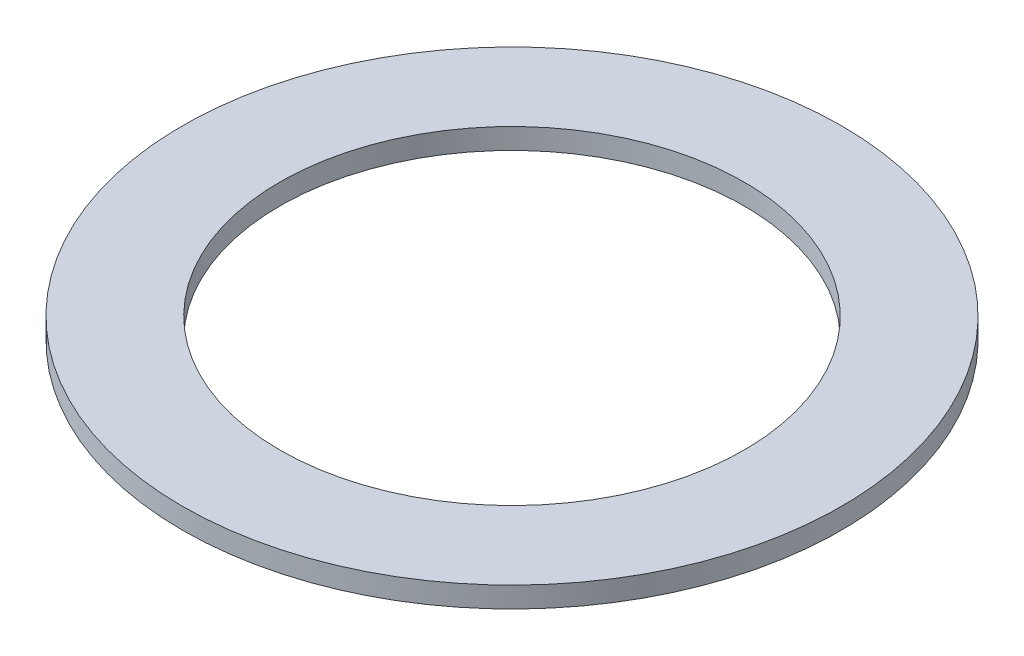
ISO-10303-21;
HEADER;
FILE_DESCRIPTION(('STEP AP214'),'2;1');
FILE_NAME('part.step','',(''),(''),'','','');
FILE_SCHEMA(('AUTOMOTIVE_DESIGN { 1 0 10303 214 1 1 1 1 }'));
ENDSEC;
DATA;
#1=APPLICATION_CONTEXT('core data for automotive mechanical design processes');
#2=APPLICATION_PROTOCOL_DEFINITION('international standard','automotive_design',2000,#1);
#3=PRODUCT_CONTEXT('',#1,'mechanical');
#4=PRODUCT('Part','Part','',(#3));
#5=PRODUCT_RELATED_PRODUCT_CATEGORY('part','',(#4));
#6=PRODUCT_DEFINITION_FORMATION('','',#4);
#7=PRODUCT_DEFINITION_CONTEXT('part definition',#1,'design');
#8=PRODUCT_DEFINITION('design','',#6,#7);
#9=PRODUCT_DEFINITION_SHAPE('','',#8);
#10=(LENGTH_UNIT() NAMED_UNIT(*) SI_UNIT(.MILLI.,.METRE.));
#11=(NAMED_UNIT(*) PLANE_ANGLE_UNIT() SI_UNIT($,.RADIAN.));
#12=(NAMED_UNIT(*) SI_UNIT($,.STERADIAN.) SOLID_ANGLE_UNIT());
#13=UNCERTAINTY_MEASURE_WITH_UNIT(LENGTH_MEASURE(1.E-05),#10,'distance_accuracy_value','');
#14=(GEOMETRIC_REPRESENTATION_CONTEXT(3) GLOBAL_UNCERTAINTY_ASSIGNED_CONTEXT((#13)) GLOBAL_UNIT_ASSIGNED_CONTEXT((#10,
#11,#12)) REPRESENTATION_CONTEXT('',''));
#15=CARTESIAN_POINT('',(0.,0.,0.));
#16=DIRECTION('',(0.,0.,1.));
#17=DIRECTION('',(1.,0.,0.));
#18=AXIS2_PLACEMENT_3D('',#15,#16,#17);
#19=CARTESIAN_POINT('',(0.,0.5,0.));
#20=DIRECTION('',(0.,1.,0.));
#21=DIRECTION('',(0.,0.,1.));
#22=AXIS2_PLACEMENT_3D('',#19,#20,#21);
#23=PLANE('',#22);
#24=CARTESIAN_POINT('',(0.,0.5,0.));
#25=DIRECTION('',(0.,1.,0.));
#26=DIRECTION('',(0.,0.,1.));
#27=AXIS2_PLACEMENT_3D('',#24,#25,#26);
#28=CIRCLE('',#27,7.95);
#29=CARTESIAN_POINT('',(0.,0.5,7.95));
#30=VERTEX_POINT('',#29);
#31=EDGE_CURVE('E10',#30,#30,#28,.T.);
#32=ORIENTED_EDGE('',*,*,#31,.T.);
#33=EDGE_LOOP('',(#32));
#34=FACE_BOUND('',#33,.T.);
#35=CARTESIAN_POINT('',(0.,0.5,0.));
#36=DIRECTION('',(0.,1.,0.));
#37=DIRECTION('',(0.,0.,1.));
#38=AXIS2_PLACEMENT_3D('',#35,#36,#37);
#39=CIRCLE('',#38,5.6);
#40=CARTESIAN_POINT('',(0.,0.5,5.6));
#41=VERTEX_POINT('',#40);
#42=EDGE_CURVE('E42',#41,#41,#39,.T.);
#43=ORIENTED_EDGE('',*,*,#42,.F.);
#44=EDGE_LOOP('',(#43));
#45=FACE_BOUND('',#44,.T.);
#46=ADVANCED_FACE('F31',(#34,#45),#23,.T.);
#47=CARTESIAN_POINT('',(0.,0.,0.));
#48=DIRECTION('',(0.,1.,0.));
#49=DIRECTION('',(0.,0.,1.));
#50=AXIS2_PLACEMENT_3D('',#47,#48,#49);
#51=PLANE('',#50);
#52=CARTESIAN_POINT('',(0.,0.,0.));
#53=DIRECTION('',(0.,1.,0.));
#54=DIRECTION('',(0.,0.,1.));
#55=AXIS2_PLACEMENT_3D('',#52,#53,#54);
#56=CIRCLE('',#55,7.95);
#57=CARTESIAN_POINT('',(0.,0.,7.95));
#58=VERTEX_POINT('',#57);
#59=EDGE_CURVE('E35',#58,#58,#56,.T.);
#60=ORIENTED_EDGE('',*,*,#59,.F.);
#61=EDGE_LOOP('',(#60));
#62=FACE_BOUND('',#61,.T.);
#63=CARTESIAN_POINT('',(0.,0.,0.));
#64=DIRECTION('',(0.,1.,0.));
#65=DIRECTION('',(0.,0.,1.));
#66=AXIS2_PLACEMENT_3D('',#63,#64,#65);
#67=CIRCLE('',#66,5.6);
#68=CARTESIAN_POINT('',(0.,0.,5.6));
#69=VERTEX_POINT('',#68);
#70=EDGE_CURVE('E44',#69,#69,#67,.T.);
#71=ORIENTED_EDGE('',*,*,#70,.T.);
#72=EDGE_LOOP('',(#71));
#73=FACE_BOUND('',#72,.T.);
#74=ADVANCED_FACE('F54',(#62,#73),#51,.F.);
#75=CARTESIAN_POINT('',(0.,0.5,0.));
#76=DIRECTION('',(0.,-1.,0.));
#77=DIRECTION('',(0.,0.,-1.));
#78=AXIS2_PLACEMENT_3D('',#75,#76,#77);
#79=CYLINDRICAL_SURFACE('',#78,7.95);
#80=ORIENTED_EDGE('',*,*,#31,.F.);
#81=EDGE_LOOP('',(#80));
#82=FACE_BOUND('',#81,.T.);
#83=ORIENTED_EDGE('',*,*,#59,.T.);
#84=EDGE_LOOP('',(#83));
#85=FACE_BOUND('',#84,.T.);
#86=ADVANCED_FACE('F33',(#82,#85),#79,.T.);
#87=CARTESIAN_POINT('',(0.,0.5,0.));
#88=DIRECTION('',(0.,-1.,0.));
#89=DIRECTION('',(0.,0.,-1.));
#90=AXIS2_PLACEMENT_3D('',#87,#88,#89);
#91=CYLINDRICAL_SURFACE('',#90,5.6);
#92=ORIENTED_EDGE('',*,*,#42,.T.);
#93=EDGE_LOOP('',(#92));
#94=FACE_BOUND('',#93,.T.);
#95=ORIENTED_EDGE('',*,*,#70,.F.);
#96=EDGE_LOOP('',(#95));
#97=FACE_BOUND('',#96,.T.);
#98=ADVANCED_FACE('F50',(#94,#97),#91,.F.);
#99=CLOSED_SHELL('',(#46,#74,#86,#98));
#100=MANIFOLD_SOLID_BREP('B2',#99);
#101=ADVANCED_BREP_SHAPE_REPRESENTATION('',(#18,#100),#14);
#102=SHAPE_DEFINITION_REPRESENTATION(#9,#101);
ENDSEC;
END-ISO-10303-21;
